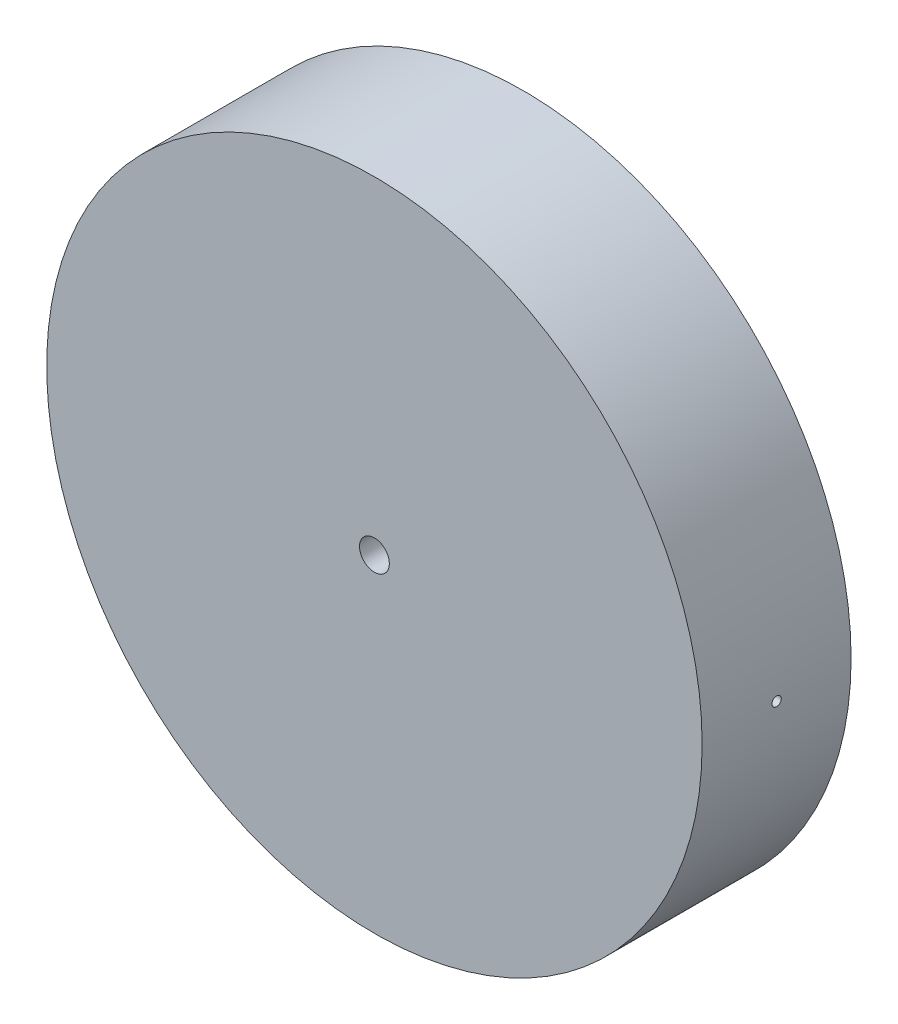
ISO-10303-21;
HEADER;
FILE_DESCRIPTION(('STEP AP214'),'2;1');
FILE_NAME('part.step','',(''),(''),'','','');
FILE_SCHEMA(('AUTOMOTIVE_DESIGN { 1 0 10303 214 1 1 1 1 }'));
ENDSEC;
DATA;
#1=APPLICATION_CONTEXT('core data for automotive mechanical design processes');
#2=APPLICATION_PROTOCOL_DEFINITION('international standard','automotive_design',2000,#1);
#3=PRODUCT_CONTEXT('',#1,'mechanical');
#4=PRODUCT('Part','Part','',(#3));
#5=PRODUCT_RELATED_PRODUCT_CATEGORY('part','',(#4));
#6=PRODUCT_DEFINITION_FORMATION('','',#4);
#7=PRODUCT_DEFINITION_CONTEXT('part definition',#1,'design');
#8=PRODUCT_DEFINITION('design','',#6,#7);
#9=PRODUCT_DEFINITION_SHAPE('','',#8);
#10=(LENGTH_UNIT() NAMED_UNIT(*) SI_UNIT(.MILLI.,.METRE.));
#11=(NAMED_UNIT(*) PLANE_ANGLE_UNIT() SI_UNIT($,.RADIAN.));
#12=(NAMED_UNIT(*) SI_UNIT($,.STERADIAN.) SOLID_ANGLE_UNIT());
#13=UNCERTAINTY_MEASURE_WITH_UNIT(LENGTH_MEASURE(1.E-05),#10,'distance_accuracy_value','');
#14=(GEOMETRIC_REPRESENTATION_CONTEXT(3) GLOBAL_UNCERTAINTY_ASSIGNED_CONTEXT((#13)) GLOBAL_UNIT_ASSIGNED_CONTEXT((#10,
#11,#12)) REPRESENTATION_CONTEXT('',''));
#15=CARTESIAN_POINT('',(0.,0.,0.));
#16=DIRECTION('',(0.,0.,1.));
#17=DIRECTION('',(1.,0.,0.));
#18=AXIS2_PLACEMENT_3D('',#15,#16,#17);
#19=CARTESIAN_POINT('',(0.,0.,40.));
#20=DIRECTION('',(0.,0.,-1.));
#21=DIRECTION('',(-1.,0.,0.));
#22=AXIS2_PLACEMENT_3D('',#19,#20,#21);
#23=CYLINDRICAL_SURFACE('',#22,88.);
#24=CARTESIAN_POINT('',(0.,0.,40.));
#25=DIRECTION('',(0.,0.,1.));
#26=DIRECTION('',(1.,0.,0.));
#27=AXIS2_PLACEMENT_3D('',#24,#25,#26);
#28=CIRCLE('',#27,88.);
#29=CARTESIAN_POINT('',(88.,0.,40.));
#30=VERTEX_POINT('',#29);
#31=EDGE_CURVE('E10',#30,#30,#28,.T.);
#32=ORIENTED_EDGE('',*,*,#31,.F.);
#33=EDGE_LOOP('',(#32));
#34=FACE_BOUND('',#33,.T.);
#35=CARTESIAN_POINT('',(0.,0.,0.));
#36=DIRECTION('',(0.,0.,1.));
#37=DIRECTION('',(1.,0.,0.));
#38=AXIS2_PLACEMENT_3D('',#35,#36,#37);
#39=CIRCLE('',#38,88.);
#40=CARTESIAN_POINT('',(88.,0.,0.));
#41=VERTEX_POINT('',#40);
#42=EDGE_CURVE('E50',#41,#41,#39,.T.);
#43=ORIENTED_EDGE('',*,*,#42,.T.);
#44=EDGE_LOOP('',(#43));
#45=FACE_BOUND('',#44,.T.);
#46=CARTESIAN_POINT('',(88.,0.,21.25));
#47=CARTESIAN_POINT('',(87.9999998800377,-0.0702092489972932,21.2499968877285));
#48=CARTESIAN_POINT('',(87.999915075171,-0.140469316170541,21.2440649439301));
#49=CARTESIAN_POINT('',(87.9995849242929,-0.279054190989367,21.2204837057922));
#50=CARTESIAN_POINT('',(87.9993393853797,-0.347376570235707,21.2028203318453));
#51=CARTESIAN_POINT('',(87.9987155799014,-0.480058284221023,21.1562794042648));
#52=CARTESIAN_POINT('',(87.998337377085,-0.544419504979935,21.1274072360664));
#53=CARTESIAN_POINT('',(87.9974909329894,-0.667363251210936,21.0592757660392));
#54=CARTESIAN_POINT('',(87.9970227140151,-0.725947202789065,21.0200190364715));
#55=CARTESIAN_POINT('',(87.9960488678917,-0.835704220468786,20.9322219405303));
#56=CARTESIAN_POINT('',(87.9955432344843,-0.886876042460308,20.8836800188228));
#57=CARTESIAN_POINT('',(87.9945516049753,-0.980346066641697,20.7786922605704));
#58=CARTESIAN_POINT('',(87.9940656096479,-1.02264391925778,20.7222461127988));
#59=CARTESIAN_POINT('',(87.9931680604272,-1.09716389151633,20.6030519085468));
#60=CARTESIAN_POINT('',(87.9927565082931,-1.12938577306255,20.5403037031943));
#61=CARTESIAN_POINT('',(87.9920542683711,-1.18283737951466,20.4102877404269));
#62=CARTESIAN_POINT('',(87.991763580286,-1.2040671314463,20.3430199941244));
#63=CARTESIAN_POINT('',(87.9913358646249,-1.23493056478996,20.205879120264));
#64=CARTESIAN_POINT('',(87.99119882683,-1.24456501737061,20.1360061662893));
#65=CARTESIAN_POINT('',(87.9910938314935,-1.25196672245389,19.9956345266932));
#66=CARTESIAN_POINT('',(87.9911258735643,-1.24973400216467,19.9251358425068));
#67=CARTESIAN_POINT('',(87.9913554150658,-1.23346544555333,19.7855192026766));
#68=CARTESIAN_POINT('',(87.9915529026082,-1.21943045730205,19.7164011481908));
#69=CARTESIAN_POINT('',(87.9920910518855,-1.17995706972944,19.581502351942));
#70=CARTESIAN_POINT('',(87.9924317138085,-1.15451865543611,19.5157216145609));
#71=CARTESIAN_POINT('',(87.9932178195357,-1.09295955950152,19.3893620994211));
#72=CARTESIAN_POINT('',(87.9936632671512,-1.05683848930835,19.3287835109796));
#73=CARTESIAN_POINT('',(87.9946087204864,-0.974939749146414,19.2145500241968));
#74=CARTESIAN_POINT('',(87.995108726217,-0.929162077260968,19.1608951272298));
#75=CARTESIAN_POINT('',(87.9961069787215,-0.829244785994515,19.0620271301562));
#76=CARTESIAN_POINT('',(87.9966052253359,-0.775104427157046,19.016814777349));
#77=CARTESIAN_POINT('',(87.9975437447656,-0.660001245672415,18.9361210546747));
#78=CARTESIAN_POINT('',(87.9979840175729,-0.599038422092284,18.9006396861384));
#79=CARTESIAN_POINT('',(87.9987569547394,-0.47202045807099,18.8404152336918));
#80=CARTESIAN_POINT('',(87.9990896188781,-0.405965307193934,18.8156721717887));
#81=CARTESIAN_POINT('',(87.9996098308618,-0.270637974408475,18.7776271822387));
#82=CARTESIAN_POINT('',(87.9997973788006,-0.201365794575223,18.7643252472117));
#83=CARTESIAN_POINT('',(88.0000062032553,-0.0615773133606124,18.7495410230733));
#84=CARTESIAN_POINT('',(88.0000274943027,0.00893887875039125,18.7480577009795));
#85=CARTESIAN_POINT('',(87.9999014431142,0.149219346516183,18.7569501195176));
#86=CARTESIAN_POINT('',(87.9997541009163,0.218983622339825,18.7673258574863));
#87=CARTESIAN_POINT('',(87.9993074029347,0.355776991692117,18.7996410073992));
#88=CARTESIAN_POINT('',(87.9990080532968,0.422806195680789,18.8215799518467));
#89=CARTESIAN_POINT('',(87.9982910859812,0.552230050132312,18.8763982586494));
#90=CARTESIAN_POINT('',(87.9978734682619,0.614624698969962,18.9092776248409));
#91=CARTESIAN_POINT('',(87.9969670032603,0.733013013547189,18.9850460952372));
#92=CARTESIAN_POINT('',(87.9964781510304,0.789006234201312,19.0279358948285));
#93=CARTESIAN_POINT('',(87.9954843431107,0.892997768245517,19.1225067160233));
#94=CARTESIAN_POINT('',(87.9949793874066,0.940996074555009,19.1741877454126));
#95=CARTESIAN_POINT('',(87.9940102602109,1.02763868375447,19.2848783856624));
#96=CARTESIAN_POINT('',(87.9935460916333,1.06628231865009,19.3438885194213));
#97=CARTESIAN_POINT('',(87.9927109165705,1.13311401857806,19.467559524715));
#98=CARTESIAN_POINT('',(87.9923399099619,1.1613020974635,19.5322203887626));
#99=CARTESIAN_POINT('',(87.9917329077899,1.20642138215259,19.6653548334032));
#100=CARTESIAN_POINT('',(87.9914969069893,1.22335302462739,19.7338282659835));
#101=CARTESIAN_POINT('',(87.9911865089379,1.24548024984499,19.8726463055395));
#102=CARTESIAN_POINT('',(87.9911121118813,1.2506758184847,19.9429909147638));
#103=CARTESIAN_POINT('',(87.9911333116033,1.24918331923666,20.0835475778434));
#104=CARTESIAN_POINT('',(87.9912288931097,1.2424963189753,20.1537596430404));
#105=CARTESIAN_POINT('',(87.9915792423198,1.21743066672381,20.2920645656219));
#106=CARTESIAN_POINT('',(87.9918340103428,1.19905199128738,20.3601574187564));
#107=CARTESIAN_POINT('',(87.992474012847,1.15112451249353,20.4922922284831));
#108=CARTESIAN_POINT('',(87.9928592497292,1.12157550357498,20.5563341105024));
#109=CARTESIAN_POINT('',(87.9937167392636,1.05214749609452,20.6785457705878));
#110=CARTESIAN_POINT('',(87.9941889885595,1.01226889594707,20.7367157750132));
#111=CARTESIAN_POINT('',(87.9951672736874,0.923314323681985,20.845535026814));
#112=CARTESIAN_POINT('',(87.9956733089589,0.874238504148654,20.8961843989336));
#113=CARTESIAN_POINT('',(87.9966622609929,0.768265873499704,20.9885382250376));
#114=CARTESIAN_POINT('',(87.9971451719832,0.711367123164722,21.0302404545394));
#115=CARTESIAN_POINT('',(87.9980335266387,0.591351126783163,21.1035180052844));
#116=CARTESIAN_POINT('',(87.9984389302359,0.52823068980426,21.1350880943342));
#117=CARTESIAN_POINT('',(87.999125752113,0.397634271055274,21.1871466255389));
#118=CARTESIAN_POINT('',(87.9994073187772,0.330163613636093,21.2076483368229));
#119=CARTESIAN_POINT('',(87.999739149518,0.218553171088004,21.2315309298026));
#120=CARTESIAN_POINT('',(87.9998365463821,0.175138435609127,21.2384481715893));
#121=CARTESIAN_POINT('',(87.9999670091437,0.087822429198807,21.2476836800187));
#122=CARTESIAN_POINT('',(88.0000000750454,0.0439211582989088,21.2500019469596));
#123=CARTESIAN_POINT('',(88.,0.,21.25));
#124=B_SPLINE_CURVE_WITH_KNOTS('',3,(#46,#47,#48,#49,#50,#51,#52,#53,#54,#55,#56,#57,#58,#59,
#60,#61,#62,#63,#64,#65,#66,#67,#68,#69,#70,#71,#72,#73,#74,#75,#76,#77,#78,#79,#80,#81,#82,#83,
#84,#85,#86,#87,#88,#89,#90,#91,#92,#93,#94,#95,#96,#97,#98,#99,#100,#101,#102,#103,#104,#105,
#106,#107,#108,#109,#110,#111,#112,#113,#114,#115,#116,#117,#118,#119,#120,#121,#122,#123),
.UNSPECIFIED.,.T.,.F.,(4,2,2,2,2,2,2,2,2,2,2,2,2,2,2,2,2,2,2,2,2,2,2,2,2,2,2,2,2,2,2,2,2,2,2,2,
2,2,4),(0.,0.210467433583402,0.421187919564294,0.631807286742272,0.842374532169377,
1.05297708000357,1.26358792258251,1.47420374154158,1.68481904266864,1.89542033562874,
2.10602114573832,2.31660682408311,2.52719277891482,2.73778639416745,2.94838005121982,
3.15899234033163,3.3696046582446,3.58021740778454,3.79083002147008,4.00142422677862,
4.21201838479447,4.42260402921101,4.63318974747339,4.84379009867509,5.05439063639119,
5.26500620814654,5.47562150084578,5.68622862266529,5.89683599756887,6.1074244507541,
6.31801332625135,6.52860607728137,6.73919070691507,6.94977184320341,7.16040527469678,
7.37114730202007,7.5816361207856,7.71329931614169,7.84496250296111),.UNSPECIFIED.);
#125=CARTESIAN_POINT('',(88.,0.,21.25));
#126=VERTEX_POINT('',#125);
#127=EDGE_CURVE('E60',#126,#126,#124,.T.);
#128=ORIENTED_EDGE('',*,*,#127,.F.);
#129=EDGE_LOOP('',(#128));
#130=FACE_BOUND('',#129,.T.);
#131=ADVANCED_FACE('F37',(#34,#45,#130),#23,.T.);
#132=CARTESIAN_POINT('',(0.,0.,40.));
#133=DIRECTION('',(0.,0.,-1.));
#134=DIRECTION('',(-1.,0.,0.));
#135=AXIS2_PLACEMENT_3D('',#132,#133,#134);
#136=CYLINDRICAL_SURFACE('',#135,4.);
#137=CARTESIAN_POINT('',(0.,0.,0.));
#138=DIRECTION('',(0.,0.,1.));
#139=DIRECTION('',(1.,0.,0.));
#140=AXIS2_PLACEMENT_3D('',#137,#138,#139);
#141=CIRCLE('',#140,4.);
#142=CARTESIAN_POINT('',(4.,0.,0.));
#143=VERTEX_POINT('',#142);
#144=EDGE_CURVE('E57',#143,#143,#141,.T.);
#145=ORIENTED_EDGE('',*,*,#144,.F.);
#146=EDGE_LOOP('',(#145));
#147=FACE_BOUND('',#146,.T.);
#148=CARTESIAN_POINT('',(0.,0.,40.));
#149=DIRECTION('',(0.,0.,1.));
#150=DIRECTION('',(1.,0.,0.));
#151=AXIS2_PLACEMENT_3D('',#148,#149,#150);
#152=CIRCLE('',#151,4.);
#153=CARTESIAN_POINT('',(4.,0.,40.));
#154=VERTEX_POINT('',#153);
#155=EDGE_CURVE('E55',#154,#154,#152,.T.);
#156=ORIENTED_EDGE('',*,*,#155,.T.);
#157=EDGE_LOOP('',(#156));
#158=FACE_BOUND('',#157,.T.);
#159=CARTESIAN_POINT('',(4.,0.,21.25));
#160=CARTESIAN_POINT('',(3.99999965877989,-0.0684391851745464,21.2499995534124));
#161=CARTESIAN_POINT('',(3.99822694984841,-0.136883052502859,21.2443607730556));
#162=CARTESIAN_POINT('',(3.99132894088807,-0.271769209588448,21.2220137584608));
#163=CARTESIAN_POINT('',(3.9862028819986,-0.338211042725907,21.2053030186356));
#164=CARTESIAN_POINT('',(3.97315815697909,-0.467128543650807,21.1614306288043));
#165=CARTESIAN_POINT('',(3.96524381499025,-0.529610176985804,21.134285155347));
#166=CARTESIAN_POINT('',(3.94743969161093,-0.64913480234646,21.0703826823217));
#167=CARTESIAN_POINT('',(3.93754959899905,-0.706176935444884,21.0336241682194));
#168=CARTESIAN_POINT('',(3.91650213740282,-0.81496533495228,20.9503440079826));
#169=CARTESIAN_POINT('',(3.90531715926989,-0.866520028156659,20.9035791149389));
#170=CARTESIAN_POINT('',(3.88310046374208,-0.961197382036994,20.8021316075864));
#171=CARTESIAN_POINT('',(3.87206877523457,-1.0043184728987,20.7474475225055));
#172=CARTESIAN_POINT('',(3.85111144698172,-1.08194336483114,20.6300554361919));
#173=CARTESIAN_POINT('',(3.84121988301796,-1.11620784150129,20.5671825224728));
#174=CARTESIAN_POINT('',(3.82407801799234,-1.17359741076672,20.4362076850181));
#175=CARTESIAN_POINT('',(3.81682702128688,-1.19672543771945,20.3681071442061));
#176=CARTESIAN_POINT('',(3.80607606984501,-1.23048459930034,20.2307719225479));
#177=CARTESIAN_POINT('',(3.80246972929508,-1.24147110007865,20.1616331563611));
#178=CARTESIAN_POINT('',(3.7991005514095,-1.25174555036988,20.0224068810881));
#179=CARTESIAN_POINT('',(3.79933669227334,-1.25103660995772,19.9523196291783));
#180=CARTESIAN_POINT('',(3.80353189075438,-1.23821824732739,19.816125539731));
#181=CARTESIAN_POINT('',(3.80734341745949,-1.22656057869383,19.7499708741384));
#182=CARTESIAN_POINT('',(3.81802025652489,-1.19290813355626,19.6206078434627));
#183=CARTESIAN_POINT('',(3.82488589343115,-1.17091225844551,19.5573997922912));
#184=CARTESIAN_POINT('',(3.84101044014297,-1.11688874681277,19.4346480555674));
#185=CARTESIAN_POINT('',(3.85030284660824,-1.08471925662082,19.375171389308));
#186=CARTESIAN_POINT('',(3.8702185658007,-1.01136020737848,19.2623122321209));
#187=CARTESIAN_POINT('',(3.88084222394551,-0.970168305215774,19.2089313297463));
#188=CARTESIAN_POINT('',(3.90281527800493,-0.877716954182125,19.107225056583));
#189=CARTESIAN_POINT('',(3.91417569605696,-0.826084570592819,19.0592404422203));
#190=CARTESIAN_POINT('',(3.9359157075958,-0.715364408095532,18.9725281064203));
#191=CARTESIAN_POINT('',(3.94629522838372,-0.656276077349022,18.9338010707808));
#192=CARTESIAN_POINT('',(3.96501294890191,-0.531664610465456,18.8664723113987));
#193=CARTESIAN_POINT('',(3.97333460648208,-0.466094906919282,18.837951864536));
#194=CARTESIAN_POINT('',(3.98687955828554,-0.330767977782646,18.7924469991484));
#195=CARTESIAN_POINT('',(3.99210379325151,-0.26101203072461,18.7754590777616));
#196=CARTESIAN_POINT('',(3.99871389395014,-0.122185157290346,18.754081957421));
#197=CARTESIAN_POINT('',(4.00024022895439,-0.0531918487888435,18.7492314564065));
#198=CARTESIAN_POINT('',(3.99969799730981,0.0846303057325841,18.7509662266373));
#199=CARTESIAN_POINT('',(3.99762995581125,0.153459174306505,18.7575498273226));
#200=CARTESIAN_POINT('',(3.99022363769772,0.287219332975852,18.7815955926064));
#201=CARTESIAN_POINT('',(3.98496793110725,0.352204978420949,18.7987832676125));
#202=CARTESIAN_POINT('',(3.97180121379252,0.478351928861366,18.8432143523667));
#203=CARTESIAN_POINT('',(3.96388987514204,0.539512760449016,18.8704590040249));
#204=CARTESIAN_POINT('',(3.94598542759568,0.657932406672231,18.9349732165488));
#205=CARTESIAN_POINT('',(3.9359462681821,0.715059739787954,18.9724709874972));
#206=CARTESIAN_POINT('',(3.91493410002887,0.822365850960094,19.056153210117));
#207=CARTESIAN_POINT('',(3.90396083845862,0.872542738043335,19.1023400177431));
#208=CARTESIAN_POINT('',(3.88176994885247,0.966587462919655,19.2042588900537));
#209=CARTESIAN_POINT('',(3.87055986714446,1.01012652339774,19.2602966637453));
#210=CARTESIAN_POINT('',(3.84961947087602,1.08721250244909,19.3791266163707));
#211=CARTESIAN_POINT('',(3.839889132814,1.12075957972524,19.4419186880044));
#212=CARTESIAN_POINT('',(3.82311782360754,1.17670083481141,19.5723451728859));
#213=CARTESIAN_POINT('',(3.81606646468027,1.19913819558886,19.6399596495047));
#214=CARTESIAN_POINT('',(3.80551170941212,1.23222894320964,19.7782724933238));
#215=CARTESIAN_POINT('',(3.80200696302675,1.2428868141461,19.8489696763713));
#216=CARTESIAN_POINT('',(3.79908292712494,1.2517940615754,19.9880040875542));
#217=CARTESIAN_POINT('',(3.79948604683077,1.25058279621957,20.0563034538129));
#218=CARTESIAN_POINT('',(3.80390090472383,1.23708818129474,20.1916745849192));
#219=CARTESIAN_POINT('',(3.80791247457319,1.22480534822559,20.258746406884));
#220=CARTESIAN_POINT('',(3.81896814158112,1.18987729913378,20.3887940396018));
#221=CARTESIAN_POINT('',(3.82596698183474,1.16738642405944,20.451815441096));
#222=CARTESIAN_POINT('',(3.84219704261348,1.11280227335064,20.5732404135314));
#223=CARTESIAN_POINT('',(3.85142871716522,1.08070704444254,20.6316430420777));
#224=CARTESIAN_POINT('',(3.8715348703158,1.00635675013475,20.7446459704406));
#225=CARTESIAN_POINT('',(3.88245948922441,0.963753335241274,20.7990081295004));
#226=CARTESIAN_POINT('',(3.90448998821726,0.870208996404849,20.8999863281118));
#227=CARTESIAN_POINT('',(3.91559591606795,0.819265842344405,20.946600288991));
#228=CARTESIAN_POINT('',(3.93717271952329,0.708486662823335,21.032282538363));
#229=CARTESIAN_POINT('',(3.94761101730634,0.648414574487383,21.07105473645));
#230=CARTESIAN_POINT('',(3.96626769296916,0.522279138013655,21.1378989151394));
#231=CARTESIAN_POINT('',(3.97448694315832,0.45621815779545,21.1659751021418));
#232=CARTESIAN_POINT('',(3.98720650733461,0.325747635373978,21.2085913676085));
#233=CARTESIAN_POINT('',(3.99196240806139,0.261670337112546,21.2240748673053));
#234=CARTESIAN_POINT('',(3.99835900340486,0.131729895440248,21.2447783599677));
#235=CARTESIAN_POINT('',(4.00000032839644,0.0658671161396749,21.250000429804));
#236=CARTESIAN_POINT('',(4.,0.,21.25));
#237=B_SPLINE_CURVE_WITH_KNOTS('',3,(#159,#160,#161,#162,#163,#164,#165,#166,#167,#168,#169,
#170,#171,#172,#173,#174,#175,#176,#177,#178,#179,#180,#181,#182,#183,#184,#185,#186,#187,#188,
#189,#190,#191,#192,#193,#194,#195,#196,#197,#198,#199,#200,#201,#202,#203,#204,#205,#206,#207,
#208,#209,#210,#211,#212,#213,#214,#215,#216,#217,#218,#219,#220,#221,#222,#223,#224,#225,#226,
#227,#228,#229,#230,#231,#232,#233,#234,#235,#236),.UNSPECIFIED.,.T.,.F.,(4,2,2,2,2,2,2,2,2,2,2,
2,2,2,2,2,2,2,2,2,2,2,2,2,2,2,2,2,2,2,2,2,2,2,2,2,2,2,4),(0.,0.205075449432509,
0.410197323349067,0.615002479202436,0.819839921558391,1.03037822195158,1.24095567431276,
1.45673771247494,1.67246286279527,1.8816915016721,2.09086450295139,2.2917691742217,
2.49269519979063,2.69655642720545,2.90047066010359,3.113667472796,3.32688007413303,
3.5417546068977,3.75656384494554,3.96307568548238,4.16955735649363,4.37090626722873,
4.572280050345,4.77856324738343,4.9849024570926,5.1994177871314,5.41392970983712,
5.62760115751032,5.84119123892432,6.04512203476055,6.24904331751086,6.44997913396672,
6.65095584330175,6.85979514006363,7.06869037373341,7.28440668126413,7.50003806666338,
7.69744636651542,7.89481470763049),.UNSPECIFIED.);
#238=CARTESIAN_POINT('',(4.,0.,21.25));
#239=VERTEX_POINT('',#238);
#240=EDGE_CURVE('E41',#239,#239,#237,.T.);
#241=ORIENTED_EDGE('',*,*,#240,.T.);
#242=EDGE_LOOP('',(#241));
#243=FACE_BOUND('',#242,.T.);
#244=ADVANCED_FACE('F72',(#147,#158,#243),#136,.F.);
#245=CARTESIAN_POINT('',(0.,0.,40.));
#246=DIRECTION('',(0.,0.,1.));
#247=DIRECTION('',(1.,0.,0.));
#248=AXIS2_PLACEMENT_3D('',#245,#246,#247);
#249=PLANE('',#248);
#250=ORIENTED_EDGE('',*,*,#155,.F.);
#251=EDGE_LOOP('',(#250));
#252=FACE_BOUND('',#251,.T.);
#253=ORIENTED_EDGE('',*,*,#31,.T.);
#254=EDGE_LOOP('',(#253));
#255=FACE_BOUND('',#254,.T.);
#256=ADVANCED_FACE('F77',(#252,#255),#249,.T.);
#257=CARTESIAN_POINT('',(0.,0.,0.));
#258=DIRECTION('',(0.,0.,1.));
#259=DIRECTION('',(1.,0.,0.));
#260=AXIS2_PLACEMENT_3D('',#257,#258,#259);
#261=PLANE('',#260);
#262=ORIENTED_EDGE('',*,*,#144,.T.);
#263=EDGE_LOOP('',(#262));
#264=FACE_BOUND('',#263,.T.);
#265=ORIENTED_EDGE('',*,*,#42,.F.);
#266=EDGE_LOOP('',(#265));
#267=FACE_BOUND('',#266,.T.);
#268=ADVANCED_FACE('F70',(#264,#267),#261,.F.);
#269=CARTESIAN_POINT('',(88.5,0.,20.));
#270=DIRECTION('',(-1.,0.,0.));
#271=DIRECTION('',(0.,0.,1.));
#272=AXIS2_PLACEMENT_3D('',#269,#270,#271);
#273=CYLINDRICAL_SURFACE('',#272,1.25);
#274=ORIENTED_EDGE('',*,*,#240,.F.);
#275=EDGE_LOOP('',(#274));
#276=FACE_BOUND('',#275,.T.);
#277=ORIENTED_EDGE('',*,*,#127,.T.);
#278=EDGE_LOOP('',(#277));
#279=FACE_BOUND('',#278,.T.);
#280=ADVANCED_FACE('F67',(#276,#279),#273,.F.);
#281=CLOSED_SHELL('',(#131,#244,#256,#268,#280));
#282=MANIFOLD_SOLID_BREP('B2',#281);
#283=ADVANCED_BREP_SHAPE_REPRESENTATION('',(#18,#282),#14);
#284=SHAPE_DEFINITION_REPRESENTATION(#9,#283);
ENDSEC;
END-ISO-10303-21;
